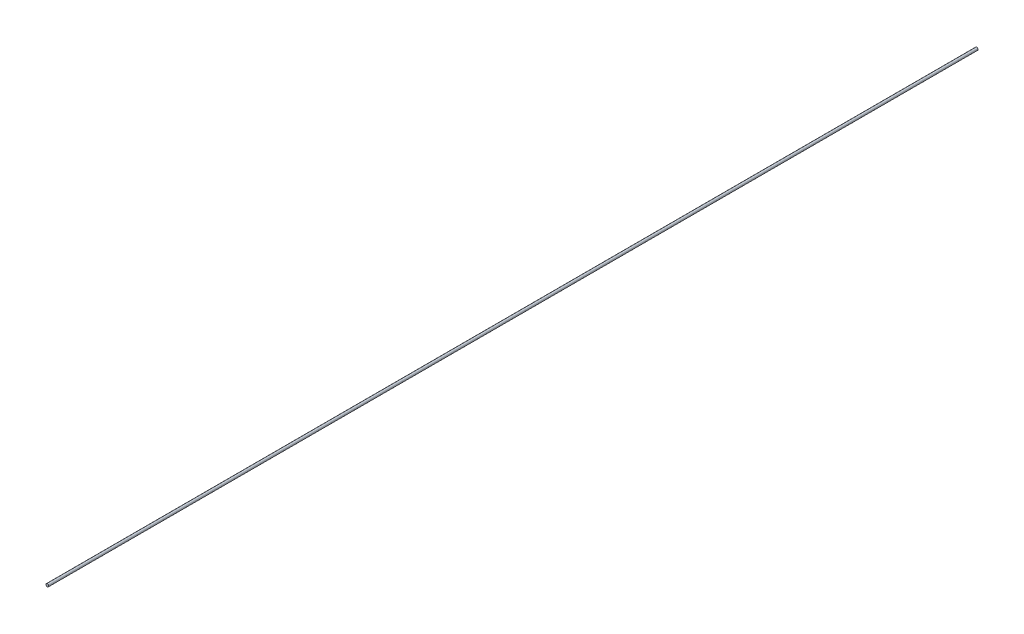
ISO-10303-21;
HEADER;
FILE_DESCRIPTION(('STEP AP214'),'2;1');
FILE_NAME('part.step','',(''),(''),'','','');
FILE_SCHEMA(('AUTOMOTIVE_DESIGN { 1 0 10303 214 1 1 1 1 }'));
ENDSEC;
DATA;
#1=APPLICATION_CONTEXT('core data for automotive mechanical design processes');
#2=APPLICATION_PROTOCOL_DEFINITION('international standard','automotive_design',2000,#1);
#3=PRODUCT_CONTEXT('',#1,'mechanical');
#4=PRODUCT('Part','Part','',(#3));
#5=PRODUCT_RELATED_PRODUCT_CATEGORY('part','',(#4));
#6=PRODUCT_DEFINITION_FORMATION('','',#4);
#7=PRODUCT_DEFINITION_CONTEXT('part definition',#1,'design');
#8=PRODUCT_DEFINITION('design','',#6,#7);
#9=PRODUCT_DEFINITION_SHAPE('','',#8);
#10=(LENGTH_UNIT() NAMED_UNIT(*) SI_UNIT(.MILLI.,.METRE.));
#11=(NAMED_UNIT(*) PLANE_ANGLE_UNIT() SI_UNIT($,.RADIAN.));
#12=(NAMED_UNIT(*) SI_UNIT($,.STERADIAN.) SOLID_ANGLE_UNIT());
#13=UNCERTAINTY_MEASURE_WITH_UNIT(LENGTH_MEASURE(1.E-05),#10,'distance_accuracy_value','');
#14=(GEOMETRIC_REPRESENTATION_CONTEXT(3) GLOBAL_UNCERTAINTY_ASSIGNED_CONTEXT((#13)) GLOBAL_UNIT_ASSIGNED_CONTEXT((#10,
#11,#12)) REPRESENTATION_CONTEXT('',''));
#15=CARTESIAN_POINT('',(0.,0.,0.));
#16=DIRECTION('',(0.,0.,1.));
#17=DIRECTION('',(1.,0.,0.));
#18=AXIS2_PLACEMENT_3D('',#15,#16,#17);
#19=CARTESIAN_POINT('',(-3.719,5.173,11.731));
#20=DIRECTION('',(0.,0.,-1.));
#21=DIRECTION('',(-1.,0.,0.));
#22=AXIS2_PLACEMENT_3D('',#19,#20,#21);
#23=CYLINDRICAL_SURFACE('',#22,0.0170000000000001);
#24=CARTESIAN_POINT('',(-3.719,5.173,11.731));
#25=DIRECTION('',(0.,0.,1.));
#26=DIRECTION('',(1.,0.,0.));
#27=AXIS2_PLACEMENT_3D('',#24,#25,#26);
#28=CIRCLE('',#27,0.0170000000000001);
#29=CARTESIAN_POINT('',(-3.702,5.173,11.731));
#30=VERTEX_POINT('',#29);
#31=EDGE_CURVE('E10',#30,#30,#28,.T.);
#32=ORIENTED_EDGE('',*,*,#31,.F.);
#33=EDGE_LOOP('',(#32));
#34=FACE_BOUND('',#33,.T.);
#35=CARTESIAN_POINT('',(-3.719,5.173,0.));
#36=DIRECTION('',(0.,0.,1.));
#37=DIRECTION('',(1.,0.,0.));
#38=AXIS2_PLACEMENT_3D('',#35,#36,#37);
#39=CIRCLE('',#38,0.0170000000000001);
#40=CARTESIAN_POINT('',(-3.702,5.173,0.));
#41=VERTEX_POINT('',#40);
#42=EDGE_CURVE('E45',#41,#41,#39,.T.);
#43=ORIENTED_EDGE('',*,*,#42,.T.);
#44=EDGE_LOOP('',(#43));
#45=FACE_BOUND('',#44,.T.);
#46=ADVANCED_FACE('F39',(#34,#45),#23,.T.);
#47=CARTESIAN_POINT('',(-3.719,5.173,11.731));
#48=DIRECTION('',(0.,0.,1.));
#49=DIRECTION('',(1.,0.,0.));
#50=AXIS2_PLACEMENT_3D('',#47,#48,#49);
#51=PLANE('',#50);
#52=ORIENTED_EDGE('',*,*,#31,.T.);
#53=EDGE_LOOP('',(#52));
#54=FACE_BOUND('',#53,.T.);
#55=ADVANCED_FACE('F53',(#54),#51,.T.);
#56=CARTESIAN_POINT('',(-3.719,5.173,0.));
#57=DIRECTION('',(0.,0.,1.));
#58=DIRECTION('',(1.,0.,0.));
#59=AXIS2_PLACEMENT_3D('',#56,#57,#58);
#60=PLANE('',#59);
#61=ORIENTED_EDGE('',*,*,#42,.F.);
#62=EDGE_LOOP('',(#61));
#63=FACE_BOUND('',#62,.T.);
#64=ADVANCED_FACE('F55',(#63),#60,.F.);
#65=CLOSED_SHELL('',(#46,#55,#64));
#66=MANIFOLD_SOLID_BREP('B2',#65);
#67=ADVANCED_BREP_SHAPE_REPRESENTATION('',(#18,#66),#14);
#68=SHAPE_DEFINITION_REPRESENTATION(#9,#67);
ENDSEC;
END-ISO-10303-21;
